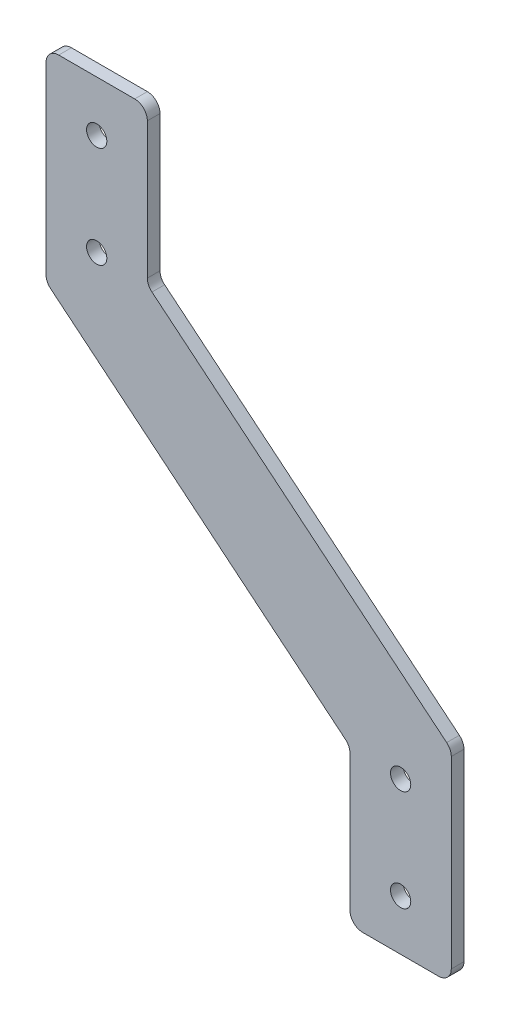
ISO-10303-21;
HEADER;
FILE_DESCRIPTION(('STEP AP214'),'2;1');
FILE_NAME('part.step','',(''),(''),'','','');
FILE_SCHEMA(('AUTOMOTIVE_DESIGN { 1 0 10303 214 1 1 1 1 }'));
ENDSEC;
DATA;
#1=APPLICATION_CONTEXT('core data for automotive mechanical design processes');
#2=APPLICATION_PROTOCOL_DEFINITION('international standard','automotive_design',2000,#1);
#3=PRODUCT_CONTEXT('',#1,'mechanical');
#4=PRODUCT('Part','Part','',(#3));
#5=PRODUCT_RELATED_PRODUCT_CATEGORY('part','',(#4));
#6=PRODUCT_DEFINITION_FORMATION('','',#4);
#7=PRODUCT_DEFINITION_CONTEXT('part definition',#1,'design');
#8=PRODUCT_DEFINITION('design','',#6,#7);
#9=PRODUCT_DEFINITION_SHAPE('','',#8);
#10=(LENGTH_UNIT() NAMED_UNIT(*) SI_UNIT(.MILLI.,.METRE.));
#11=(NAMED_UNIT(*) PLANE_ANGLE_UNIT() SI_UNIT($,.RADIAN.));
#12=(NAMED_UNIT(*) SI_UNIT($,.STERADIAN.) SOLID_ANGLE_UNIT());
#13=UNCERTAINTY_MEASURE_WITH_UNIT(LENGTH_MEASURE(1.E-05),#10,'distance_accuracy_value','');
#14=(GEOMETRIC_REPRESENTATION_CONTEXT(3) GLOBAL_UNCERTAINTY_ASSIGNED_CONTEXT((#13)) GLOBAL_UNIT_ASSIGNED_CONTEXT((#10,
#11,#12)) REPRESENTATION_CONTEXT('',''));
#15=CARTESIAN_POINT('',(0.,0.,0.));
#16=DIRECTION('',(0.,0.,1.));
#17=DIRECTION('',(1.,0.,0.));
#18=AXIS2_PLACEMENT_3D('',#15,#16,#17);
#19=CARTESIAN_POINT('',(0.,0.,3.175));
#20=DIRECTION('',(0.,0.,-1.));
#21=DIRECTION('',(-1.,0.,0.));
#22=AXIS2_PLACEMENT_3D('',#19,#20,#21);
#23=PLANE('',#22);
#24=DIRECTION('',(0.,-1.,0.));
#25=VECTOR('',#24,1.);
#26=CARTESIAN_POINT('',(-88.9,139.7,3.175));
#27=LINE('',#26,#25);
#28=CARTESIAN_POINT('',(-88.9,136.525,3.175));
#29=VERTEX_POINT('',#28);
#30=CARTESIAN_POINT('',(-88.9,90.3979008291483,3.175));
#31=VERTEX_POINT('',#30);
#32=EDGE_CURVE('E186',#29,#31,#27,.T.);
#33=ORIENTED_EDGE('',*,*,#32,.T.);
#34=CARTESIAN_POINT('',(-85.725,90.3979008291483,3.175));
#35=DIRECTION('',(0.,0.,-1.));
#36=DIRECTION('',(-1.,0.,0.));
#37=AXIS2_PLACEMENT_3D('',#34,#35,#36);
#38=CIRCLE('',#37,3.175);
#39=CARTESIAN_POINT('',(-87.7439504145742,87.9475,3.175));
#40=VERTEX_POINT('',#39);
#41=EDGE_CURVE('E225',#31,#40,#38,.F.);
#42=ORIENTED_EDGE('',*,*,#41,.T.);
#43=DIRECTION('',(0.771779788708135,-0.635889894354067,0.));
#44=VECTOR('',#43,1.);
#45=CARTESIAN_POINT('',(-88.9,88.9,3.175));
#46=LINE('',#45,#44);
#47=CARTESIAN_POINT('',(-13.8560495854258,27.0692933668134,3.175));
#48=VERTEX_POINT('',#47);
#49=EDGE_CURVE('E168',#40,#48,#46,.T.);
#50=ORIENTED_EDGE('',*,*,#49,.T.);
#51=CARTESIAN_POINT('',(-15.875,24.6188925376651,3.175));
#52=DIRECTION('',(0.,0.,-1.));
#53=DIRECTION('',(-1.,0.,0.));
#54=AXIS2_PLACEMENT_3D('',#51,#52,#53);
#55=CIRCLE('',#54,3.175);
#56=CARTESIAN_POINT('',(-12.7,24.6188925376651,3.175));
#57=VERTEX_POINT('',#56);
#58=EDGE_CURVE('E257',#48,#57,#55,.T.);
#59=ORIENTED_EDGE('',*,*,#58,.T.);
#60=DIRECTION('',(0.,-1.,0.));
#61=VECTOR('',#60,1.);
#62=CARTESIAN_POINT('',(-12.7,26.1167933668134,3.175));
#63=LINE('',#62,#61);
#64=CARTESIAN_POINT('',(-12.7,-9.525,3.175));
#65=VERTEX_POINT('',#64);
#66=EDGE_CURVE('E287',#57,#65,#63,.T.);
#67=ORIENTED_EDGE('',*,*,#66,.T.);
#68=CARTESIAN_POINT('',(-9.525,-9.525,3.175));
#69=DIRECTION('',(0.,0.,-1.));
#70=DIRECTION('',(-1.,0.,0.));
#71=AXIS2_PLACEMENT_3D('',#68,#69,#70);
#72=CIRCLE('',#71,3.175);
#73=CARTESIAN_POINT('',(-9.525,-12.7,3.175));
#74=VERTEX_POINT('',#73);
#75=EDGE_CURVE('E216',#65,#74,#72,.F.);
#76=ORIENTED_EDGE('',*,*,#75,.T.);
#77=DIRECTION('',(1.,0.,0.));
#78=VECTOR('',#77,1.);
#79=CARTESIAN_POINT('',(-12.7,-12.7,3.175));
#80=LINE('',#79,#78);
#81=CARTESIAN_POINT('',(9.525,-12.7,3.175));
#82=VERTEX_POINT('',#81);
#83=EDGE_CURVE('E284',#74,#82,#80,.T.);
#84=ORIENTED_EDGE('',*,*,#83,.T.);
#85=CARTESIAN_POINT('',(9.525,-9.525,3.175));
#86=DIRECTION('',(0.,0.,-1.));
#87=DIRECTION('',(-1.,0.,0.));
#88=AXIS2_PLACEMENT_3D('',#85,#86,#87);
#89=CIRCLE('',#88,3.175);
#90=CARTESIAN_POINT('',(12.7,-9.525,3.175));
#91=VERTEX_POINT('',#90);
#92=EDGE_CURVE('E218',#82,#91,#89,.F.);
#93=ORIENTED_EDGE('',*,*,#92,.T.);
#94=DIRECTION('',(0.,1.,0.));
#95=VECTOR('',#94,1.);
#96=CARTESIAN_POINT('',(12.7,-12.7,3.175));
#97=LINE('',#96,#95);
#98=CARTESIAN_POINT('',(12.7,36.6020991708517,3.175));
#99=VERTEX_POINT('',#98);
#100=EDGE_CURVE('E279',#91,#99,#97,.T.);
#101=ORIENTED_EDGE('',*,*,#100,.T.);
#102=CARTESIAN_POINT('',(9.52500000000001,36.6020991708517,3.175));
#103=DIRECTION('',(0.,0.,-1.));
#104=DIRECTION('',(-1.,0.,0.));
#105=AXIS2_PLACEMENT_3D('',#102,#103,#104);
#106=CIRCLE('',#105,3.175);
#107=CARTESIAN_POINT('',(11.5439504145742,39.0525,3.175));
#108=VERTEX_POINT('',#107);
#109=EDGE_CURVE('E220',#99,#108,#106,.F.);
#110=ORIENTED_EDGE('',*,*,#109,.T.);
#111=DIRECTION('',(-0.771779788708135,0.635889894354067,0.));
#112=VECTOR('',#111,1.);
#113=CARTESIAN_POINT('',(12.7,38.1,3.175));
#114=LINE('',#113,#112);
#115=CARTESIAN_POINT('',(-62.3439504145742,99.9307066331866,3.175));
#116=VERTEX_POINT('',#115);
#117=EDGE_CURVE('E273',#108,#116,#114,.T.);
#118=ORIENTED_EDGE('',*,*,#117,.T.);
#119=CARTESIAN_POINT('',(-60.325,102.381107462335,3.175));
#120=DIRECTION('',(0.,0.,-1.));
#121=DIRECTION('',(-1.,0.,0.));
#122=AXIS2_PLACEMENT_3D('',#119,#120,#121);
#123=CIRCLE('',#122,3.175);
#124=CARTESIAN_POINT('',(-63.5,102.381107462335,3.175));
#125=VERTEX_POINT('',#124);
#126=EDGE_CURVE('E11',#116,#125,#123,.T.);
#127=ORIENTED_EDGE('',*,*,#126,.T.);
#128=DIRECTION('',(0.,1.,0.));
#129=VECTOR('',#128,1.);
#130=CARTESIAN_POINT('',(-63.5,100.883206633187,3.175));
#131=LINE('',#130,#129);
#132=CARTESIAN_POINT('',(-63.5,136.525,3.175));
#133=VERTEX_POINT('',#132);
#134=EDGE_CURVE('E272',#125,#133,#131,.T.);
#135=ORIENTED_EDGE('',*,*,#134,.T.);
#136=CARTESIAN_POINT('',(-66.675,136.525,3.175));
#137=DIRECTION('',(0.,0.,-1.));
#138=DIRECTION('',(-1.,0.,0.));
#139=AXIS2_PLACEMENT_3D('',#136,#137,#138);
#140=CIRCLE('',#139,3.175);
#141=CARTESIAN_POINT('',(-66.675,139.7,3.175));
#142=VERTEX_POINT('',#141);
#143=EDGE_CURVE('E56',#133,#142,#140,.F.);
#144=ORIENTED_EDGE('',*,*,#143,.T.);
#145=DIRECTION('',(-1.,0.,0.));
#146=VECTOR('',#145,1.);
#147=CARTESIAN_POINT('',(-63.5,139.7,3.175));
#148=LINE('',#147,#146);
#149=CARTESIAN_POINT('',(-85.725,139.7,3.175));
#150=VERTEX_POINT('',#149);
#151=EDGE_CURVE('E277',#142,#150,#148,.T.);
#152=ORIENTED_EDGE('',*,*,#151,.T.);
#153=CARTESIAN_POINT('',(-85.725,136.525,3.175));
#154=DIRECTION('',(0.,0.,-1.));
#155=DIRECTION('',(-1.,0.,0.));
#156=AXIS2_PLACEMENT_3D('',#153,#154,#155);
#157=CIRCLE('',#156,3.175);
#158=EDGE_CURVE('E223',#150,#29,#157,.F.);
#159=ORIENTED_EDGE('',*,*,#158,.T.);
#160=EDGE_LOOP('',(#33,#42,#50,#59,#67,#76,#84,#93,#101,#110,#118,#127,#135,#144,#152,#159));
#161=FACE_BOUND('',#160,.T.);
#162=CARTESIAN_POINT('',(0.,25.4,3.175));
#163=DIRECTION('',(0.,0.,1.));
#164=DIRECTION('',(1.,0.,0.));
#165=AXIS2_PLACEMENT_3D('',#162,#163,#164);
#166=CIRCLE('',#165,2.54);
#167=CARTESIAN_POINT('',(2.54,25.4,3.175));
#168=VERTEX_POINT('',#167);
#169=EDGE_CURVE('E177',#168,#168,#166,.T.);
#170=ORIENTED_EDGE('',*,*,#169,.F.);
#171=EDGE_LOOP('',(#170));
#172=FACE_BOUND('',#171,.T.);
#173=CARTESIAN_POINT('',(0.,0.,3.175));
#174=DIRECTION('',(0.,0.,1.));
#175=DIRECTION('',(1.,0.,0.));
#176=AXIS2_PLACEMENT_3D('',#173,#174,#175);
#177=CIRCLE('',#176,2.54);
#178=CARTESIAN_POINT('',(2.54,0.,3.175));
#179=VERTEX_POINT('',#178);
#180=EDGE_CURVE('E292',#179,#179,#177,.T.);
#181=ORIENTED_EDGE('',*,*,#180,.F.);
#182=EDGE_LOOP('',(#181));
#183=FACE_BOUND('',#182,.T.);
#184=CARTESIAN_POINT('',(-76.2,127.,3.175));
#185=DIRECTION('',(0.,0.,1.));
#186=DIRECTION('',(1.,0.,0.));
#187=AXIS2_PLACEMENT_3D('',#184,#185,#186);
#188=CIRCLE('',#187,2.54);
#189=CARTESIAN_POINT('',(-73.66,127.,3.175));
#190=VERTEX_POINT('',#189);
#191=EDGE_CURVE('E297',#190,#190,#188,.T.);
#192=ORIENTED_EDGE('',*,*,#191,.F.);
#193=EDGE_LOOP('',(#192));
#194=FACE_BOUND('',#193,.T.);
#195=CARTESIAN_POINT('',(-76.2,101.6,3.175));
#196=DIRECTION('',(0.,0.,1.));
#197=DIRECTION('',(1.,0.,0.));
#198=AXIS2_PLACEMENT_3D('',#195,#196,#197);
#199=CIRCLE('',#198,2.53999999999999);
#200=CARTESIAN_POINT('',(-73.66,101.6,3.175));
#201=VERTEX_POINT('',#200);
#202=EDGE_CURVE('E303',#201,#201,#199,.T.);
#203=ORIENTED_EDGE('',*,*,#202,.F.);
#204=EDGE_LOOP('',(#203));
#205=FACE_BOUND('',#204,.T.);
#206=ADVANCED_FACE('F34',(#161,#172,#183,#194,#205),#23,.F.);
#207=CARTESIAN_POINT('',(0.,0.,0.));
#208=DIRECTION('',(0.,0.,-1.));
#209=DIRECTION('',(-1.,0.,0.));
#210=AXIS2_PLACEMENT_3D('',#207,#208,#209);
#211=PLANE('',#210);
#212=CARTESIAN_POINT('',(-76.2,127.,0.));
#213=DIRECTION('',(0.,0.,1.));
#214=DIRECTION('',(1.,0.,0.));
#215=AXIS2_PLACEMENT_3D('',#212,#213,#214);
#216=CIRCLE('',#215,2.54);
#217=CARTESIAN_POINT('',(-73.66,127.,0.));
#218=VERTEX_POINT('',#217);
#219=EDGE_CURVE('E300',#218,#218,#216,.T.);
#220=ORIENTED_EDGE('',*,*,#219,.T.);
#221=EDGE_LOOP('',(#220));
#222=FACE_BOUND('',#221,.T.);
#223=CARTESIAN_POINT('',(0.,25.4,0.));
#224=DIRECTION('',(0.,0.,1.));
#225=DIRECTION('',(1.,0.,0.));
#226=AXIS2_PLACEMENT_3D('',#223,#224,#225);
#227=CIRCLE('',#226,2.54);
#228=CARTESIAN_POINT('',(2.54,25.4,0.));
#229=VERTEX_POINT('',#228);
#230=EDGE_CURVE('E183',#229,#229,#227,.T.);
#231=ORIENTED_EDGE('',*,*,#230,.T.);
#232=EDGE_LOOP('',(#231));
#233=FACE_BOUND('',#232,.T.);
#234=DIRECTION('',(0.771779788708135,-0.635889894354067,0.));
#235=VECTOR('',#234,1.);
#236=CARTESIAN_POINT('',(-88.9,88.9,0.));
#237=LINE('',#236,#235);
#238=CARTESIAN_POINT('',(-87.7439504145742,87.9475,0.));
#239=VERTEX_POINT('',#238);
#240=CARTESIAN_POINT('',(-13.8560495854258,27.0692933668134,0.));
#241=VERTEX_POINT('',#240);
#242=EDGE_CURVE('E165',#239,#241,#237,.T.);
#243=ORIENTED_EDGE('',*,*,#242,.F.);
#244=CARTESIAN_POINT('',(-85.725,90.3979008291483,0.));
#245=DIRECTION('',(0.,0.,-1.));
#246=DIRECTION('',(-1.,0.,0.));
#247=AXIS2_PLACEMENT_3D('',#244,#245,#246);
#248=CIRCLE('',#247,3.175);
#249=CARTESIAN_POINT('',(-88.9,90.3979008291483,0.));
#250=VERTEX_POINT('',#249);
#251=EDGE_CURVE('E148',#239,#250,#248,.T.);
#252=ORIENTED_EDGE('',*,*,#251,.T.);
#253=DIRECTION('',(0.,-1.,0.));
#254=VECTOR('',#253,1.);
#255=CARTESIAN_POINT('',(-88.9,139.7,0.));
#256=LINE('',#255,#254);
#257=CARTESIAN_POINT('',(-88.9,136.525,0.));
#258=VERTEX_POINT('',#257);
#259=EDGE_CURVE('E202',#258,#250,#256,.T.);
#260=ORIENTED_EDGE('',*,*,#259,.F.);
#261=CARTESIAN_POINT('',(-85.725,136.525,0.));
#262=DIRECTION('',(0.,0.,-1.));
#263=DIRECTION('',(-1.,0.,0.));
#264=AXIS2_PLACEMENT_3D('',#261,#262,#263);
#265=CIRCLE('',#264,3.175);
#266=CARTESIAN_POINT('',(-85.725,139.7,0.));
#267=VERTEX_POINT('',#266);
#268=EDGE_CURVE('E159',#258,#267,#265,.T.);
#269=ORIENTED_EDGE('',*,*,#268,.T.);
#270=DIRECTION('',(-1.,0.,0.));
#271=VECTOR('',#270,1.);
#272=CARTESIAN_POINT('',(-63.5,139.7,0.));
#273=LINE('',#272,#271);
#274=CARTESIAN_POINT('',(-66.675,139.7,0.));
#275=VERTEX_POINT('',#274);
#276=EDGE_CURVE('E200',#275,#267,#273,.T.);
#277=ORIENTED_EDGE('',*,*,#276,.F.);
#278=CARTESIAN_POINT('',(-66.675,136.525,0.));
#279=DIRECTION('',(0.,0.,-1.));
#280=DIRECTION('',(-1.,0.,0.));
#281=AXIS2_PLACEMENT_3D('',#278,#279,#280);
#282=CIRCLE('',#281,3.175);
#283=CARTESIAN_POINT('',(-63.5,136.525,0.));
#284=VERTEX_POINT('',#283);
#285=EDGE_CURVE('E210',#275,#284,#282,.T.);
#286=ORIENTED_EDGE('',*,*,#285,.T.);
#287=DIRECTION('',(0.,1.,0.));
#288=VECTOR('',#287,1.);
#289=CARTESIAN_POINT('',(-63.5,100.883206633187,0.));
#290=LINE('',#289,#288);
#291=CARTESIAN_POINT('',(-63.5,102.381107462335,0.));
#292=VERTEX_POINT('',#291);
#293=EDGE_CURVE('E197',#292,#284,#290,.T.);
#294=ORIENTED_EDGE('',*,*,#293,.F.);
#295=CARTESIAN_POINT('',(-60.325,102.381107462335,0.));
#296=DIRECTION('',(0.,0.,-1.));
#297=DIRECTION('',(-1.,0.,0.));
#298=AXIS2_PLACEMENT_3D('',#295,#296,#297);
#299=CIRCLE('',#298,3.175);
#300=CARTESIAN_POINT('',(-62.3439504145742,99.9307066331866,0.));
#301=VERTEX_POINT('',#300);
#302=EDGE_CURVE('E42',#292,#301,#299,.F.);
#303=ORIENTED_EDGE('',*,*,#302,.T.);
#304=DIRECTION('',(-0.771779788708135,0.635889894354067,0.));
#305=VECTOR('',#304,1.);
#306=CARTESIAN_POINT('',(12.7,38.1,0.));
#307=LINE('',#306,#305);
#308=CARTESIAN_POINT('',(11.5439504145742,39.0525,0.));
#309=VERTEX_POINT('',#308);
#310=EDGE_CURVE('E194',#309,#301,#307,.T.);
#311=ORIENTED_EDGE('',*,*,#310,.F.);
#312=CARTESIAN_POINT('',(9.52500000000001,36.6020991708517,0.));
#313=DIRECTION('',(0.,0.,-1.));
#314=DIRECTION('',(-1.,0.,0.));
#315=AXIS2_PLACEMENT_3D('',#312,#313,#314);
#316=CIRCLE('',#315,3.175);
#317=CARTESIAN_POINT('',(12.7,36.6020991708517,0.));
#318=VERTEX_POINT('',#317);
#319=EDGE_CURVE('E208',#309,#318,#316,.T.);
#320=ORIENTED_EDGE('',*,*,#319,.T.);
#321=DIRECTION('',(0.,1.,0.));
#322=VECTOR('',#321,1.);
#323=CARTESIAN_POINT('',(12.7,-12.7,0.));
#324=LINE('',#323,#322);
#325=CARTESIAN_POINT('',(12.7,-9.525,0.));
#326=VERTEX_POINT('',#325);
#327=EDGE_CURVE('E191',#326,#318,#324,.T.);
#328=ORIENTED_EDGE('',*,*,#327,.F.);
#329=CARTESIAN_POINT('',(9.525,-9.525,0.));
#330=DIRECTION('',(0.,0.,-1.));
#331=DIRECTION('',(-1.,0.,0.));
#332=AXIS2_PLACEMENT_3D('',#329,#330,#331);
#333=CIRCLE('',#332,3.175);
#334=CARTESIAN_POINT('',(9.525,-12.7,0.));
#335=VERTEX_POINT('',#334);
#336=EDGE_CURVE('E206',#326,#335,#333,.T.);
#337=ORIENTED_EDGE('',*,*,#336,.T.);
#338=DIRECTION('',(1.,0.,0.));
#339=VECTOR('',#338,1.);
#340=CARTESIAN_POINT('',(-12.7,-12.7,0.));
#341=LINE('',#340,#339);
#342=CARTESIAN_POINT('',(-9.525,-12.7,0.));
#343=VERTEX_POINT('',#342);
#344=EDGE_CURVE('E180',#343,#335,#341,.T.);
#345=ORIENTED_EDGE('',*,*,#344,.F.);
#346=CARTESIAN_POINT('',(-9.525,-9.525,0.));
#347=DIRECTION('',(0.,0.,-1.));
#348=DIRECTION('',(-1.,0.,0.));
#349=AXIS2_PLACEMENT_3D('',#346,#347,#348);
#350=CIRCLE('',#349,3.175);
#351=CARTESIAN_POINT('',(-12.7,-9.525,0.));
#352=VERTEX_POINT('',#351);
#353=EDGE_CURVE('E169',#343,#352,#350,.T.);
#354=ORIENTED_EDGE('',*,*,#353,.T.);
#355=DIRECTION('',(0.,-1.,0.));
#356=VECTOR('',#355,1.);
#357=CARTESIAN_POINT('',(-12.7,26.1167933668134,0.));
#358=LINE('',#357,#356);
#359=CARTESIAN_POINT('',(-12.7,24.6188925376651,0.));
#360=VERTEX_POINT('',#359);
#361=EDGE_CURVE('E176',#360,#352,#358,.T.);
#362=ORIENTED_EDGE('',*,*,#361,.F.);
#363=CARTESIAN_POINT('',(-15.875,24.6188925376651,0.));
#364=DIRECTION('',(0.,0.,-1.));
#365=DIRECTION('',(-1.,0.,0.));
#366=AXIS2_PLACEMENT_3D('',#363,#364,#365);
#367=CIRCLE('',#366,3.175);
#368=EDGE_CURVE('E175',#360,#241,#367,.F.);
#369=ORIENTED_EDGE('',*,*,#368,.T.);
#370=EDGE_LOOP('',(#243,#252,#260,#269,#277,#286,#294,#303,#311,#320,#328,#337,#345,#354,#362,#369));
#371=FACE_BOUND('',#370,.T.);
#372=CARTESIAN_POINT('',(0.,0.,0.));
#373=DIRECTION('',(0.,0.,1.));
#374=DIRECTION('',(1.,0.,0.));
#375=AXIS2_PLACEMENT_3D('',#372,#373,#374);
#376=CIRCLE('',#375,2.54);
#377=CARTESIAN_POINT('',(2.54,0.,0.));
#378=VERTEX_POINT('',#377);
#379=EDGE_CURVE('E294',#378,#378,#376,.T.);
#380=ORIENTED_EDGE('',*,*,#379,.T.);
#381=EDGE_LOOP('',(#380));
#382=FACE_BOUND('',#381,.T.);
#383=CARTESIAN_POINT('',(-76.2,101.6,0.));
#384=DIRECTION('',(0.,0.,1.));
#385=DIRECTION('',(1.,0.,0.));
#386=AXIS2_PLACEMENT_3D('',#383,#384,#385);
#387=CIRCLE('',#386,2.53999999999999);
#388=CARTESIAN_POINT('',(-73.66,101.6,0.));
#389=VERTEX_POINT('',#388);
#390=EDGE_CURVE('E306',#389,#389,#387,.T.);
#391=ORIENTED_EDGE('',*,*,#390,.T.);
#392=EDGE_LOOP('',(#391));
#393=FACE_BOUND('',#392,.T.);
#394=ADVANCED_FACE('F172',(#222,#233,#371,#382,#393),#211,.T.);
#395=CARTESIAN_POINT('',(-88.9,88.9,3.175));
#396=DIRECTION('',(0.635889894354067,0.771779788708135,0.));
#397=DIRECTION('',(-0.771779788708135,0.635889894354067,0.));
#398=AXIS2_PLACEMENT_3D('',#395,#396,#397);
#399=PLANE('',#398);
#400=ORIENTED_EDGE('',*,*,#49,.F.);
#401=DIRECTION('',(0.,0.,-1.));
#402=VECTOR('',#401,1.);
#403=CARTESIAN_POINT('',(-87.7439504145742,87.9475,3.175));
#404=LINE('',#403,#402);
#405=EDGE_CURVE('E152',#40,#239,#404,.T.);
#406=ORIENTED_EDGE('',*,*,#405,.T.);
#407=ORIENTED_EDGE('',*,*,#242,.T.);
#408=DIRECTION('',(0.,0.,-1.));
#409=VECTOR('',#408,1.);
#410=CARTESIAN_POINT('',(-13.8560495854258,27.0692933668134,3.175));
#411=LINE('',#410,#409);
#412=EDGE_CURVE('E170',#241,#48,#411,.F.);
#413=ORIENTED_EDGE('',*,*,#412,.T.);
#414=EDGE_LOOP('',(#400,#406,#407,#413));
#415=FACE_BOUND('',#414,.T.);
#416=ADVANCED_FACE('F164',(#415),#399,.F.);
#417=CARTESIAN_POINT('',(-12.7,26.1167933668134,3.175));
#418=DIRECTION('',(1.,0.,0.));
#419=DIRECTION('',(0.,1.,0.));
#420=AXIS2_PLACEMENT_3D('',#417,#418,#419);
#421=PLANE('',#420);
#422=ORIENTED_EDGE('',*,*,#361,.T.);
#423=DIRECTION('',(0.,0.,-1.));
#424=VECTOR('',#423,1.);
#425=CARTESIAN_POINT('',(-12.7,-9.525,3.175));
#426=LINE('',#425,#424);
#427=EDGE_CURVE('E254',#352,#65,#426,.F.);
#428=ORIENTED_EDGE('',*,*,#427,.T.);
#429=ORIENTED_EDGE('',*,*,#66,.F.);
#430=DIRECTION('',(0.,0.,-1.));
#431=VECTOR('',#430,1.);
#432=CARTESIAN_POINT('',(-12.7,24.6188925376651,0.));
#433=LINE('',#432,#431);
#434=EDGE_CURVE('E251',#57,#360,#433,.T.);
#435=ORIENTED_EDGE('',*,*,#434,.T.);
#436=EDGE_LOOP('',(#422,#428,#429,#435));
#437=FACE_BOUND('',#436,.T.);
#438=ADVANCED_FACE('F344',(#437),#421,.F.);
#439=CARTESIAN_POINT('',(-12.7,-12.7,3.175));
#440=DIRECTION('',(0.,1.,0.));
#441=DIRECTION('',(0.,0.,1.));
#442=AXIS2_PLACEMENT_3D('',#439,#440,#441);
#443=PLANE('',#442);
#444=ORIENTED_EDGE('',*,*,#344,.T.);
#445=DIRECTION('',(0.,0.,-1.));
#446=VECTOR('',#445,1.);
#447=CARTESIAN_POINT('',(9.525,-12.7,3.175));
#448=LINE('',#447,#446);
#449=EDGE_CURVE('E249',#335,#82,#448,.F.);
#450=ORIENTED_EDGE('',*,*,#449,.T.);
#451=ORIENTED_EDGE('',*,*,#83,.F.);
#452=DIRECTION('',(0.,0.,-1.));
#453=VECTOR('',#452,1.);
#454=CARTESIAN_POINT('',(-9.525,-12.7,3.175));
#455=LINE('',#454,#453);
#456=EDGE_CURVE('E246',#74,#343,#455,.T.);
#457=ORIENTED_EDGE('',*,*,#456,.T.);
#458=EDGE_LOOP('',(#444,#450,#451,#457));
#459=FACE_BOUND('',#458,.T.);
#460=ADVANCED_FACE('F340',(#459),#443,.F.);
#461=CARTESIAN_POINT('',(12.7,-12.7,3.175));
#462=DIRECTION('',(-1.,0.,0.));
#463=DIRECTION('',(0.,-1.,0.));
#464=AXIS2_PLACEMENT_3D('',#461,#462,#463);
#465=PLANE('',#464);
#466=ORIENTED_EDGE('',*,*,#327,.T.);
#467=DIRECTION('',(0.,0.,-1.));
#468=VECTOR('',#467,1.);
#469=CARTESIAN_POINT('',(12.7,36.6020991708517,3.175));
#470=LINE('',#469,#468);
#471=EDGE_CURVE('E244',#318,#99,#470,.F.);
#472=ORIENTED_EDGE('',*,*,#471,.T.);
#473=ORIENTED_EDGE('',*,*,#100,.F.);
#474=DIRECTION('',(0.,0.,-1.));
#475=VECTOR('',#474,1.);
#476=CARTESIAN_POINT('',(12.7,-9.525,3.175));
#477=LINE('',#476,#475);
#478=EDGE_CURVE('E241',#91,#326,#477,.T.);
#479=ORIENTED_EDGE('',*,*,#478,.T.);
#480=EDGE_LOOP('',(#466,#472,#473,#479));
#481=FACE_BOUND('',#480,.T.);
#482=ADVANCED_FACE('F337',(#481),#465,.F.);
#483=CARTESIAN_POINT('',(12.7,38.1,3.175));
#484=DIRECTION('',(-0.635889894354067,-0.771779788708135,0.));
#485=DIRECTION('',(0.771779788708135,-0.635889894354067,0.));
#486=AXIS2_PLACEMENT_3D('',#483,#484,#485);
#487=PLANE('',#486);
#488=ORIENTED_EDGE('',*,*,#117,.F.);
#489=DIRECTION('',(0.,0.,-1.));
#490=VECTOR('',#489,1.);
#491=CARTESIAN_POINT('',(11.5439504145742,39.0525,3.175));
#492=LINE('',#491,#490);
#493=EDGE_CURVE('E238',#108,#309,#492,.T.);
#494=ORIENTED_EDGE('',*,*,#493,.T.);
#495=ORIENTED_EDGE('',*,*,#310,.T.);
#496=DIRECTION('',(0.,0.,-1.));
#497=VECTOR('',#496,1.);
#498=CARTESIAN_POINT('',(-62.3439504145742,99.9307066331866,3.175));
#499=LINE('',#498,#497);
#500=EDGE_CURVE('E236',#301,#116,#499,.F.);
#501=ORIENTED_EDGE('',*,*,#500,.T.);
#502=EDGE_LOOP('',(#488,#494,#495,#501));
#503=FACE_BOUND('',#502,.T.);
#504=ADVANCED_FACE('F265',(#503),#487,.F.);
#505=CARTESIAN_POINT('',(-63.5,100.883206633187,3.175));
#506=DIRECTION('',(-1.,0.,0.));
#507=DIRECTION('',(0.,0.,1.));
#508=AXIS2_PLACEMENT_3D('',#505,#506,#507);
#509=PLANE('',#508);
#510=ORIENTED_EDGE('',*,*,#293,.T.);
#511=DIRECTION('',(0.,0.,-1.));
#512=VECTOR('',#511,1.);
#513=CARTESIAN_POINT('',(-63.5,136.525,3.175));
#514=LINE('',#513,#512);
#515=EDGE_CURVE('E234',#284,#133,#514,.F.);
#516=ORIENTED_EDGE('',*,*,#515,.T.);
#517=ORIENTED_EDGE('',*,*,#134,.F.);
#518=DIRECTION('',(0.,0.,-1.));
#519=VECTOR('',#518,1.);
#520=CARTESIAN_POINT('',(-63.5,102.381107462335,0.));
#521=LINE('',#520,#519);
#522=EDGE_CURVE('E231',#125,#292,#521,.T.);
#523=ORIENTED_EDGE('',*,*,#522,.T.);
#524=EDGE_LOOP('',(#510,#516,#517,#523));
#525=FACE_BOUND('',#524,.T.);
#526=ADVANCED_FACE('F275',(#525),#509,.F.);
#527=CARTESIAN_POINT('',(-63.5,139.7,3.175));
#528=DIRECTION('',(0.,-1.,0.));
#529=DIRECTION('',(0.,0.,-1.));
#530=AXIS2_PLACEMENT_3D('',#527,#528,#529);
#531=PLANE('',#530);
#532=ORIENTED_EDGE('',*,*,#276,.T.);
#533=DIRECTION('',(0.,0.,-1.));
#534=VECTOR('',#533,1.);
#535=CARTESIAN_POINT('',(-85.725,139.7,3.175));
#536=LINE('',#535,#534);
#537=EDGE_CURVE('E49',#267,#150,#536,.F.);
#538=ORIENTED_EDGE('',*,*,#537,.T.);
#539=ORIENTED_EDGE('',*,*,#151,.F.);
#540=DIRECTION('',(0.,0.,-1.));
#541=VECTOR('',#540,1.);
#542=CARTESIAN_POINT('',(-66.675,139.7,3.175));
#543=LINE('',#542,#541);
#544=EDGE_CURVE('E227',#142,#275,#543,.T.);
#545=ORIENTED_EDGE('',*,*,#544,.T.);
#546=EDGE_LOOP('',(#532,#538,#539,#545));
#547=FACE_BOUND('',#546,.T.);
#548=ADVANCED_FACE('F329',(#547),#531,.F.);
#549=CARTESIAN_POINT('',(-88.9,139.7,3.175));
#550=DIRECTION('',(1.,0.,0.));
#551=DIRECTION('',(0.,0.,-1.));
#552=AXIS2_PLACEMENT_3D('',#549,#550,#551);
#553=PLANE('',#552);
#554=ORIENTED_EDGE('',*,*,#259,.T.);
#555=DIRECTION('',(0.,0.,-1.));
#556=VECTOR('',#555,1.);
#557=CARTESIAN_POINT('',(-88.9,90.3979008291483,3.175));
#558=LINE('',#557,#556);
#559=EDGE_CURVE('E153',#250,#31,#558,.F.);
#560=ORIENTED_EDGE('',*,*,#559,.T.);
#561=ORIENTED_EDGE('',*,*,#32,.F.);
#562=DIRECTION('',(0.,0.,-1.));
#563=VECTOR('',#562,1.);
#564=CARTESIAN_POINT('',(-88.9,136.525,3.175));
#565=LINE('',#564,#563);
#566=EDGE_CURVE('E158',#29,#258,#565,.T.);
#567=ORIENTED_EDGE('',*,*,#566,.T.);
#568=EDGE_LOOP('',(#554,#560,#561,#567));
#569=FACE_BOUND('',#568,.T.);
#570=ADVANCED_FACE('F326',(#569),#553,.F.);
#571=CARTESIAN_POINT('',(0.,25.4,3.175));
#572=DIRECTION('',(0.,0.,-1.));
#573=DIRECTION('',(-1.,0.,0.));
#574=AXIS2_PLACEMENT_3D('',#571,#572,#573);
#575=CYLINDRICAL_SURFACE('',#574,2.54);
#576=ORIENTED_EDGE('',*,*,#169,.T.);
#577=EDGE_LOOP('',(#576));
#578=FACE_BOUND('',#577,.T.);
#579=ORIENTED_EDGE('',*,*,#230,.F.);
#580=EDGE_LOOP('',(#579));
#581=FACE_BOUND('',#580,.T.);
#582=ADVANCED_FACE('F323',(#578,#581),#575,.F.);
#583=CARTESIAN_POINT('',(0.,0.,3.175));
#584=DIRECTION('',(0.,0.,-1.));
#585=DIRECTION('',(-1.,0.,0.));
#586=AXIS2_PLACEMENT_3D('',#583,#584,#585);
#587=CYLINDRICAL_SURFACE('',#586,2.54);
#588=ORIENTED_EDGE('',*,*,#180,.T.);
#589=EDGE_LOOP('',(#588));
#590=FACE_BOUND('',#589,.T.);
#591=ORIENTED_EDGE('',*,*,#379,.F.);
#592=EDGE_LOOP('',(#591));
#593=FACE_BOUND('',#592,.T.);
#594=ADVANCED_FACE('F518',(#590,#593),#587,.F.);
#595=CARTESIAN_POINT('',(-76.2,127.,3.175));
#596=DIRECTION('',(0.,0.,-1.));
#597=DIRECTION('',(-1.,0.,0.));
#598=AXIS2_PLACEMENT_3D('',#595,#596,#597);
#599=CYLINDRICAL_SURFACE('',#598,2.54);
#600=ORIENTED_EDGE('',*,*,#191,.T.);
#601=EDGE_LOOP('',(#600));
#602=FACE_BOUND('',#601,.T.);
#603=ORIENTED_EDGE('',*,*,#219,.F.);
#604=EDGE_LOOP('',(#603));
#605=FACE_BOUND('',#604,.T.);
#606=ADVANCED_FACE('F509',(#602,#605),#599,.F.);
#607=CARTESIAN_POINT('',(-76.2,101.6,3.175));
#608=DIRECTION('',(0.,0.,-1.));
#609=DIRECTION('',(-1.,0.,0.));
#610=AXIS2_PLACEMENT_3D('',#607,#608,#609);
#611=CYLINDRICAL_SURFACE('',#610,2.53999999999999);
#612=ORIENTED_EDGE('',*,*,#202,.T.);
#613=EDGE_LOOP('',(#612));
#614=FACE_BOUND('',#613,.T.);
#615=ORIENTED_EDGE('',*,*,#390,.F.);
#616=EDGE_LOOP('',(#615));
#617=FACE_BOUND('',#616,.T.);
#618=ADVANCED_FACE('F312',(#614,#617),#611,.F.);
#619=CARTESIAN_POINT('',(-85.725,90.3979008291483,3.175));
#620=DIRECTION('',(0.,0.,-1.));
#621=DIRECTION('',(-1.,0.,0.));
#622=AXIS2_PLACEMENT_3D('',#619,#620,#621);
#623=CYLINDRICAL_SURFACE('',#622,3.175);
#624=ORIENTED_EDGE('',*,*,#41,.F.);
#625=ORIENTED_EDGE('',*,*,#559,.F.);
#626=ORIENTED_EDGE('',*,*,#251,.F.);
#627=ORIENTED_EDGE('',*,*,#405,.F.);
#628=EDGE_LOOP('',(#624,#625,#626,#627));
#629=FACE_BOUND('',#628,.T.);
#630=ADVANCED_FACE('F151',(#629),#623,.T.);
#631=CARTESIAN_POINT('',(-85.725,136.525,3.175));
#632=DIRECTION('',(0.,0.,-1.));
#633=DIRECTION('',(-1.,0.,0.));
#634=AXIS2_PLACEMENT_3D('',#631,#632,#633);
#635=CYLINDRICAL_SURFACE('',#634,3.175);
#636=ORIENTED_EDGE('',*,*,#158,.F.);
#637=ORIENTED_EDGE('',*,*,#537,.F.);
#638=ORIENTED_EDGE('',*,*,#268,.F.);
#639=ORIENTED_EDGE('',*,*,#566,.F.);
#640=EDGE_LOOP('',(#636,#637,#638,#639));
#641=FACE_BOUND('',#640,.T.);
#642=ADVANCED_FACE('F353',(#641),#635,.T.);
#643=CARTESIAN_POINT('',(-66.675,136.525,3.175));
#644=DIRECTION('',(0.,0.,-1.));
#645=DIRECTION('',(-1.,0.,0.));
#646=AXIS2_PLACEMENT_3D('',#643,#644,#645);
#647=CYLINDRICAL_SURFACE('',#646,3.175);
#648=ORIENTED_EDGE('',*,*,#143,.F.);
#649=ORIENTED_EDGE('',*,*,#515,.F.);
#650=ORIENTED_EDGE('',*,*,#285,.F.);
#651=ORIENTED_EDGE('',*,*,#544,.F.);
#652=EDGE_LOOP('',(#648,#649,#650,#651));
#653=FACE_BOUND('',#652,.T.);
#654=ADVANCED_FACE('F356',(#653),#647,.T.);
#655=CARTESIAN_POINT('',(9.52500000000001,36.6020991708517,3.175));
#656=DIRECTION('',(0.,0.,-1.));
#657=DIRECTION('',(-1.,0.,0.));
#658=AXIS2_PLACEMENT_3D('',#655,#656,#657);
#659=CYLINDRICAL_SURFACE('',#658,3.175);
#660=ORIENTED_EDGE('',*,*,#109,.F.);
#661=ORIENTED_EDGE('',*,*,#471,.F.);
#662=ORIENTED_EDGE('',*,*,#319,.F.);
#663=ORIENTED_EDGE('',*,*,#493,.F.);
#664=EDGE_LOOP('',(#660,#661,#662,#663));
#665=FACE_BOUND('',#664,.T.);
#666=ADVANCED_FACE('F360',(#665),#659,.T.);
#667=CARTESIAN_POINT('',(9.525,-9.525,3.175));
#668=DIRECTION('',(0.,0.,-1.));
#669=DIRECTION('',(-1.,0.,0.));
#670=AXIS2_PLACEMENT_3D('',#667,#668,#669);
#671=CYLINDRICAL_SURFACE('',#670,3.175);
#672=ORIENTED_EDGE('',*,*,#92,.F.);
#673=ORIENTED_EDGE('',*,*,#449,.F.);
#674=ORIENTED_EDGE('',*,*,#336,.F.);
#675=ORIENTED_EDGE('',*,*,#478,.F.);
#676=EDGE_LOOP('',(#672,#673,#674,#675));
#677=FACE_BOUND('',#676,.T.);
#678=ADVANCED_FACE('F364',(#677),#671,.T.);
#679=CARTESIAN_POINT('',(-9.525,-9.525,3.175));
#680=DIRECTION('',(0.,0.,-1.));
#681=DIRECTION('',(-1.,0.,0.));
#682=AXIS2_PLACEMENT_3D('',#679,#680,#681);
#683=CYLINDRICAL_SURFACE('',#682,3.175);
#684=ORIENTED_EDGE('',*,*,#75,.F.);
#685=ORIENTED_EDGE('',*,*,#427,.F.);
#686=ORIENTED_EDGE('',*,*,#353,.F.);
#687=ORIENTED_EDGE('',*,*,#456,.F.);
#688=EDGE_LOOP('',(#684,#685,#686,#687));
#689=FACE_BOUND('',#688,.T.);
#690=ADVANCED_FACE('F368',(#689),#683,.T.);
#691=CARTESIAN_POINT('',(-15.875,24.6188925376651,3.175));
#692=DIRECTION('',(0.,0.,1.));
#693=DIRECTION('',(1.,0.,0.));
#694=AXIS2_PLACEMENT_3D('',#691,#692,#693);
#695=CYLINDRICAL_SURFACE('',#694,3.175);
#696=ORIENTED_EDGE('',*,*,#58,.F.);
#697=ORIENTED_EDGE('',*,*,#412,.F.);
#698=ORIENTED_EDGE('',*,*,#368,.F.);
#699=ORIENTED_EDGE('',*,*,#434,.F.);
#700=EDGE_LOOP('',(#696,#697,#698,#699));
#701=FACE_BOUND('',#700,.T.);
#702=ADVANCED_FACE('F371',(#701),#695,.F.);
#703=CARTESIAN_POINT('',(-60.325,102.381107462335,3.175));
#704=DIRECTION('',(0.,0.,1.));
#705=DIRECTION('',(1.,0.,0.));
#706=AXIS2_PLACEMENT_3D('',#703,#704,#705);
#707=CYLINDRICAL_SURFACE('',#706,3.175);
#708=ORIENTED_EDGE('',*,*,#126,.F.);
#709=ORIENTED_EDGE('',*,*,#500,.F.);
#710=ORIENTED_EDGE('',*,*,#302,.F.);
#711=ORIENTED_EDGE('',*,*,#522,.F.);
#712=EDGE_LOOP('',(#708,#709,#710,#711));
#713=FACE_BOUND('',#712,.T.);
#714=ADVANCED_FACE('F36',(#713),#707,.F.);
#715=CLOSED_SHELL('',(#206,#394,#416,#438,#460,#482,#504,#526,#548,#570,#582,#594,#606,#618,
#630,#642,#654,#666,#678,#690,#702,#714));
#716=MANIFOLD_SOLID_BREP('B2',#715);
#717=ADVANCED_BREP_SHAPE_REPRESENTATION('',(#18,#716),#14);
#718=SHAPE_DEFINITION_REPRESENTATION(#9,#717);
ENDSEC;
END-ISO-10303-21;
